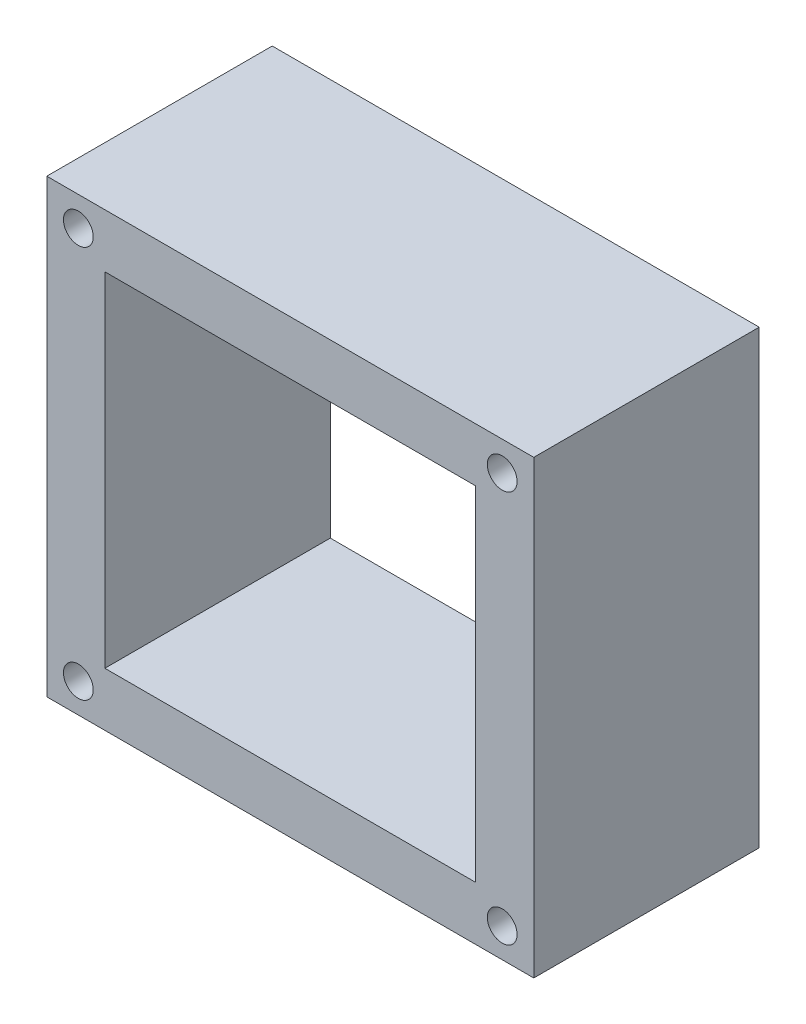
ISO-10303-21;
HEADER;
FILE_DESCRIPTION(('STEP AP214'),'2;1');
FILE_NAME('part.step','',(''),(''),'','','');
FILE_SCHEMA(('AUTOMOTIVE_DESIGN { 1 0 10303 214 1 1 1 1 }'));
ENDSEC;
DATA;
#1=APPLICATION_CONTEXT('core data for automotive mechanical design processes');
#2=APPLICATION_PROTOCOL_DEFINITION('international standard','automotive_design',2000,#1);
#3=PRODUCT_CONTEXT('',#1,'mechanical');
#4=PRODUCT('Part','Part','',(#3));
#5=PRODUCT_RELATED_PRODUCT_CATEGORY('part','',(#4));
#6=PRODUCT_DEFINITION_FORMATION('','',#4);
#7=PRODUCT_DEFINITION_CONTEXT('part definition',#1,'design');
#8=PRODUCT_DEFINITION('design','',#6,#7);
#9=PRODUCT_DEFINITION_SHAPE('','',#8);
#10=(LENGTH_UNIT() NAMED_UNIT(*) SI_UNIT(.MILLI.,.METRE.));
#11=(NAMED_UNIT(*) PLANE_ANGLE_UNIT() SI_UNIT($,.RADIAN.));
#12=(NAMED_UNIT(*) SI_UNIT($,.STERADIAN.) SOLID_ANGLE_UNIT());
#13=UNCERTAINTY_MEASURE_WITH_UNIT(LENGTH_MEASURE(1.E-05),#10,'distance_accuracy_value','');
#14=(GEOMETRIC_REPRESENTATION_CONTEXT(3) GLOBAL_UNCERTAINTY_ASSIGNED_CONTEXT((#13)) GLOBAL_UNIT_ASSIGNED_CONTEXT((#10,
#11,#12)) REPRESENTATION_CONTEXT('',''));
#15=CARTESIAN_POINT('',(0.,0.,0.));
#16=DIRECTION('',(0.,0.,1.));
#17=DIRECTION('',(1.,0.,0.));
#18=AXIS2_PLACEMENT_3D('',#15,#16,#17);
#19=CARTESIAN_POINT('',(0.,0.,50.));
#20=DIRECTION('',(0.,0.,-1.));
#21=DIRECTION('',(-1.,0.,0.));
#22=AXIS2_PLACEMENT_3D('',#19,#20,#21);
#23=PLANE('',#22);
#24=CARTESIAN_POINT('',(-47.,43.5,50.));
#25=DIRECTION('',(0.,0.,1.));
#26=DIRECTION('',(1.,0.,0.));
#27=AXIS2_PLACEMENT_3D('',#24,#25,#26);
#28=CIRCLE('',#27,3.29999999999999);
#29=CARTESIAN_POINT('',(-43.7,43.5,50.));
#30=VERTEX_POINT('',#29);
#31=EDGE_CURVE('E135',#30,#30,#28,.T.);
#32=ORIENTED_EDGE('',*,*,#31,.F.);
#33=EDGE_LOOP('',(#32));
#34=FACE_BOUND('',#33,.T.);
#35=CARTESIAN_POINT('',(-47.,-43.5,50.));
#36=DIRECTION('',(0.,0.,1.));
#37=DIRECTION('',(1.,0.,0.));
#38=AXIS2_PLACEMENT_3D('',#35,#36,#37);
#39=CIRCLE('',#38,3.3);
#40=CARTESIAN_POINT('',(-43.7,-43.5,50.));
#41=VERTEX_POINT('',#40);
#42=EDGE_CURVE('E141',#41,#41,#39,.T.);
#43=ORIENTED_EDGE('',*,*,#42,.F.);
#44=EDGE_LOOP('',(#43));
#45=FACE_BOUND('',#44,.T.);
#46=CARTESIAN_POINT('',(47.,-43.5,50.));
#47=DIRECTION('',(0.,0.,1.));
#48=DIRECTION('',(1.,0.,0.));
#49=AXIS2_PLACEMENT_3D('',#46,#47,#48);
#50=CIRCLE('',#49,3.3);
#51=CARTESIAN_POINT('',(50.3,-43.5,50.));
#52=VERTEX_POINT('',#51);
#53=EDGE_CURVE('E147',#52,#52,#50,.T.);
#54=ORIENTED_EDGE('',*,*,#53,.F.);
#55=EDGE_LOOP('',(#54));
#56=FACE_BOUND('',#55,.T.);
#57=CARTESIAN_POINT('',(47.,43.5,50.));
#58=DIRECTION('',(0.,0.,1.));
#59=DIRECTION('',(1.,0.,0.));
#60=AXIS2_PLACEMENT_3D('',#57,#58,#59);
#61=CIRCLE('',#60,3.29999999999999);
#62=CARTESIAN_POINT('',(50.3,43.5,50.));
#63=VERTEX_POINT('',#62);
#64=EDGE_CURVE('E153',#63,#63,#61,.T.);
#65=ORIENTED_EDGE('',*,*,#64,.F.);
#66=EDGE_LOOP('',(#65));
#67=FACE_BOUND('',#66,.T.);
#68=DIRECTION('',(0.,-1.,0.));
#69=VECTOR('',#68,1.);
#70=CARTESIAN_POINT('',(-54.,50.,50.));
#71=LINE('',#70,#69);
#72=CARTESIAN_POINT('',(-54.,50.,50.));
#73=VERTEX_POINT('',#72);
#74=CARTESIAN_POINT('',(-54.,-50.,50.));
#75=VERTEX_POINT('',#74);
#76=EDGE_CURVE('E159',#73,#75,#71,.T.);
#77=ORIENTED_EDGE('',*,*,#76,.T.);
#78=DIRECTION('',(1.,0.,0.));
#79=VECTOR('',#78,1.);
#80=CARTESIAN_POINT('',(54.,-50.,50.));
#81=LINE('',#80,#79);
#82=CARTESIAN_POINT('',(54.,-50.,50.));
#83=VERTEX_POINT('',#82);
#84=EDGE_CURVE('E162',#75,#83,#81,.T.);
#85=ORIENTED_EDGE('',*,*,#84,.T.);
#86=DIRECTION('',(0.,1.,0.));
#87=VECTOR('',#86,1.);
#88=CARTESIAN_POINT('',(54.,50.,50.));
#89=LINE('',#88,#87);
#90=CARTESIAN_POINT('',(54.,50.,50.));
#91=VERTEX_POINT('',#90);
#92=EDGE_CURVE('E165',#83,#91,#89,.T.);
#93=ORIENTED_EDGE('',*,*,#92,.T.);
#94=DIRECTION('',(-1.,0.,0.));
#95=VECTOR('',#94,1.);
#96=CARTESIAN_POINT('',(54.,50.,50.));
#97=LINE('',#96,#95);
#98=EDGE_CURVE('E167',#91,#73,#97,.T.);
#99=ORIENTED_EDGE('',*,*,#98,.T.);
#100=EDGE_LOOP('',(#77,#85,#93,#99));
#101=FACE_BOUND('',#100,.T.);
#102=DIRECTION('',(0.,1.,0.));
#103=VECTOR('',#102,1.);
#104=CARTESIAN_POINT('',(41.1206911699069,-38.0747140462101,50.));
#105=LINE('',#104,#103);
#106=CARTESIAN_POINT('',(41.1206911699069,-38.0747140462101,50.));
#107=VERTEX_POINT('',#106);
#108=CARTESIAN_POINT('',(41.1206911699069,38.0747140462101,50.));
#109=VERTEX_POINT('',#108);
#110=EDGE_CURVE('E99',#107,#109,#105,.T.);
#111=ORIENTED_EDGE('',*,*,#110,.F.);
#112=DIRECTION('',(1.,0.,0.));
#113=VECTOR('',#112,1.);
#114=CARTESIAN_POINT('',(-41.1206911699069,-38.0747140462101,50.));
#115=LINE('',#114,#113);
#116=CARTESIAN_POINT('',(-41.1206911699069,-38.0747140462101,50.));
#117=VERTEX_POINT('',#116);
#118=EDGE_CURVE('E121',#117,#107,#115,.T.);
#119=ORIENTED_EDGE('',*,*,#118,.F.);
#120=DIRECTION('',(0.,-1.,0.));
#121=VECTOR('',#120,1.);
#122=CARTESIAN_POINT('',(-41.1206911699069,-38.0747140462101,50.));
#123=LINE('',#122,#121);
#124=CARTESIAN_POINT('',(-41.1206911699069,38.0747140462101,50.));
#125=VERTEX_POINT('',#124);
#126=EDGE_CURVE('E119',#125,#117,#123,.T.);
#127=ORIENTED_EDGE('',*,*,#126,.F.);
#128=DIRECTION('',(-1.,0.,0.));
#129=VECTOR('',#128,1.);
#130=CARTESIAN_POINT('',(-41.1206911699069,38.0747140462101,50.));
#131=LINE('',#130,#129);
#132=EDGE_CURVE('E107',#109,#125,#131,.T.);
#133=ORIENTED_EDGE('',*,*,#132,.F.);
#134=EDGE_LOOP('',(#111,#119,#127,#133));
#135=FACE_BOUND('',#134,.T.);
#136=ADVANCED_FACE('F34',(#34,#45,#56,#67,#101,#135),#23,.F.);
#137=CARTESIAN_POINT('',(0.,0.,0.));
#138=DIRECTION('',(0.,0.,-1.));
#139=DIRECTION('',(-1.,0.,0.));
#140=AXIS2_PLACEMENT_3D('',#137,#138,#139);
#141=PLANE('',#140);
#142=CARTESIAN_POINT('',(-47.,-43.5,0.));
#143=DIRECTION('',(0.,0.,1.));
#144=DIRECTION('',(1.,0.,0.));
#145=AXIS2_PLACEMENT_3D('',#142,#143,#144);
#146=CIRCLE('',#145,3.3);
#147=CARTESIAN_POINT('',(-43.7,-43.5,0.));
#148=VERTEX_POINT('',#147);
#149=EDGE_CURVE('E138',#148,#148,#146,.T.);
#150=ORIENTED_EDGE('',*,*,#149,.T.);
#151=EDGE_LOOP('',(#150));
#152=FACE_BOUND('',#151,.T.);
#153=CARTESIAN_POINT('',(47.,43.5,0.));
#154=DIRECTION('',(0.,0.,1.));
#155=DIRECTION('',(1.,0.,0.));
#156=AXIS2_PLACEMENT_3D('',#153,#154,#155);
#157=CIRCLE('',#156,3.29999999999999);
#158=CARTESIAN_POINT('',(50.3,43.5,0.));
#159=VERTEX_POINT('',#158);
#160=EDGE_CURVE('E150',#159,#159,#157,.T.);
#161=ORIENTED_EDGE('',*,*,#160,.T.);
#162=EDGE_LOOP('',(#161));
#163=FACE_BOUND('',#162,.T.);
#164=DIRECTION('',(0.,-1.,0.));
#165=VECTOR('',#164,1.);
#166=CARTESIAN_POINT('',(-54.,50.,0.));
#167=LINE('',#166,#165);
#168=CARTESIAN_POINT('',(-54.,50.,0.));
#169=VERTEX_POINT('',#168);
#170=CARTESIAN_POINT('',(-54.,-50.,0.));
#171=VERTEX_POINT('',#170);
#172=EDGE_CURVE('E156',#169,#171,#167,.T.);
#173=ORIENTED_EDGE('',*,*,#172,.F.);
#174=DIRECTION('',(-1.,0.,0.));
#175=VECTOR('',#174,1.);
#176=CARTESIAN_POINT('',(54.,50.,0.));
#177=LINE('',#176,#175);
#178=CARTESIAN_POINT('',(54.,50.,0.));
#179=VERTEX_POINT('',#178);
#180=EDGE_CURVE('E163',#179,#169,#177,.T.);
#181=ORIENTED_EDGE('',*,*,#180,.F.);
#182=DIRECTION('',(0.,1.,0.));
#183=VECTOR('',#182,1.);
#184=CARTESIAN_POINT('',(54.,50.,0.));
#185=LINE('',#184,#183);
#186=CARTESIAN_POINT('',(54.,-50.,0.));
#187=VERTEX_POINT('',#186);
#188=EDGE_CURVE('E174',#187,#179,#185,.T.);
#189=ORIENTED_EDGE('',*,*,#188,.F.);
#190=DIRECTION('',(1.,0.,0.));
#191=VECTOR('',#190,1.);
#192=CARTESIAN_POINT('',(54.,-50.,0.));
#193=LINE('',#192,#191);
#194=EDGE_CURVE('E172',#171,#187,#193,.T.);
#195=ORIENTED_EDGE('',*,*,#194,.F.);
#196=EDGE_LOOP('',(#173,#181,#189,#195));
#197=FACE_BOUND('',#196,.T.);
#198=CARTESIAN_POINT('',(47.,-43.5,0.));
#199=DIRECTION('',(0.,0.,1.));
#200=DIRECTION('',(1.,0.,0.));
#201=AXIS2_PLACEMENT_3D('',#198,#199,#200);
#202=CIRCLE('',#201,3.3);
#203=CARTESIAN_POINT('',(50.3,-43.5,0.));
#204=VERTEX_POINT('',#203);
#205=EDGE_CURVE('E144',#204,#204,#202,.T.);
#206=ORIENTED_EDGE('',*,*,#205,.T.);
#207=EDGE_LOOP('',(#206));
#208=FACE_BOUND('',#207,.T.);
#209=CARTESIAN_POINT('',(-47.,43.5,0.));
#210=DIRECTION('',(0.,0.,1.));
#211=DIRECTION('',(1.,0.,0.));
#212=AXIS2_PLACEMENT_3D('',#209,#210,#211);
#213=CIRCLE('',#212,3.29999999999999);
#214=CARTESIAN_POINT('',(-43.7,43.5,0.));
#215=VERTEX_POINT('',#214);
#216=EDGE_CURVE('E115',#215,#215,#213,.T.);
#217=ORIENTED_EDGE('',*,*,#216,.T.);
#218=EDGE_LOOP('',(#217));
#219=FACE_BOUND('',#218,.T.);
#220=DIRECTION('',(1.,0.,0.));
#221=VECTOR('',#220,1.);
#222=CARTESIAN_POINT('',(-41.1206911699069,-38.0747140462101,0.));
#223=LINE('',#222,#221);
#224=CARTESIAN_POINT('',(-41.1206911699069,-38.0747140462101,0.));
#225=VERTEX_POINT('',#224);
#226=CARTESIAN_POINT('',(41.1206911699069,-38.0747140462101,0.));
#227=VERTEX_POINT('',#226);
#228=EDGE_CURVE('E108',#225,#227,#223,.T.);
#229=ORIENTED_EDGE('',*,*,#228,.T.);
#230=DIRECTION('',(0.,1.,0.));
#231=VECTOR('',#230,1.);
#232=CARTESIAN_POINT('',(41.1206911699069,-38.0747140462101,0.));
#233=LINE('',#232,#231);
#234=CARTESIAN_POINT('',(41.1206911699069,38.0747140462101,0.));
#235=VERTEX_POINT('',#234);
#236=EDGE_CURVE('E57',#227,#235,#233,.T.);
#237=ORIENTED_EDGE('',*,*,#236,.T.);
#238=DIRECTION('',(-1.,0.,0.));
#239=VECTOR('',#238,1.);
#240=CARTESIAN_POINT('',(-41.1206911699069,38.0747140462101,0.));
#241=LINE('',#240,#239);
#242=CARTESIAN_POINT('',(-41.1206911699069,38.0747140462101,0.));
#243=VERTEX_POINT('',#242);
#244=EDGE_CURVE('E114',#235,#243,#241,.T.);
#245=ORIENTED_EDGE('',*,*,#244,.T.);
#246=DIRECTION('',(0.,-1.,0.));
#247=VECTOR('',#246,1.);
#248=CARTESIAN_POINT('',(-41.1206911699069,-38.0747140462101,0.));
#249=LINE('',#248,#247);
#250=EDGE_CURVE('E127',#243,#225,#249,.T.);
#251=ORIENTED_EDGE('',*,*,#250,.T.);
#252=EDGE_LOOP('',(#229,#237,#245,#251));
#253=FACE_BOUND('',#252,.T.);
#254=ADVANCED_FACE('F192',(#152,#163,#197,#208,#219,#253),#141,.T.);
#255=CARTESIAN_POINT('',(-54.,50.,50.));
#256=DIRECTION('',(1.,0.,0.));
#257=DIRECTION('',(0.,0.,-1.));
#258=AXIS2_PLACEMENT_3D('',#255,#256,#257);
#259=PLANE('',#258);
#260=ORIENTED_EDGE('',*,*,#172,.T.);
#261=DIRECTION('',(0.,0.,-1.));
#262=VECTOR('',#261,1.);
#263=CARTESIAN_POINT('',(-54.,-50.,50.));
#264=LINE('',#263,#262);
#265=EDGE_CURVE('E11',#75,#171,#264,.T.);
#266=ORIENTED_EDGE('',*,*,#265,.F.);
#267=ORIENTED_EDGE('',*,*,#76,.F.);
#268=DIRECTION('',(0.,0.,-1.));
#269=VECTOR('',#268,1.);
#270=CARTESIAN_POINT('',(-54.,50.,50.));
#271=LINE('',#270,#269);
#272=EDGE_CURVE('E169',#73,#169,#271,.T.);
#273=ORIENTED_EDGE('',*,*,#272,.T.);
#274=EDGE_LOOP('',(#260,#266,#267,#273));
#275=FACE_BOUND('',#274,.T.);
#276=ADVANCED_FACE('F36',(#275),#259,.F.);
#277=CARTESIAN_POINT('',(54.,-50.,50.));
#278=DIRECTION('',(0.,1.,0.));
#279=DIRECTION('',(0.,0.,1.));
#280=AXIS2_PLACEMENT_3D('',#277,#278,#279);
#281=PLANE('',#280);
#282=ORIENTED_EDGE('',*,*,#194,.T.);
#283=DIRECTION('',(0.,0.,-1.));
#284=VECTOR('',#283,1.);
#285=CARTESIAN_POINT('',(54.,-50.,50.));
#286=LINE('',#285,#284);
#287=EDGE_CURVE('E42',#83,#187,#286,.T.);
#288=ORIENTED_EDGE('',*,*,#287,.F.);
#289=ORIENTED_EDGE('',*,*,#84,.F.);
#290=ORIENTED_EDGE('',*,*,#265,.T.);
#291=EDGE_LOOP('',(#282,#288,#289,#290));
#292=FACE_BOUND('',#291,.T.);
#293=ADVANCED_FACE('F202',(#292),#281,.F.);
#294=CARTESIAN_POINT('',(54.,50.,50.));
#295=DIRECTION('',(-1.,0.,0.));
#296=DIRECTION('',(0.,0.,1.));
#297=AXIS2_PLACEMENT_3D('',#294,#295,#296);
#298=PLANE('',#297);
#299=ORIENTED_EDGE('',*,*,#188,.T.);
#300=DIRECTION('',(0.,0.,-1.));
#301=VECTOR('',#300,1.);
#302=CARTESIAN_POINT('',(54.,50.,50.));
#303=LINE('',#302,#301);
#304=EDGE_CURVE('E179',#91,#179,#303,.T.);
#305=ORIENTED_EDGE('',*,*,#304,.F.);
#306=ORIENTED_EDGE('',*,*,#92,.F.);
#307=ORIENTED_EDGE('',*,*,#287,.T.);
#308=EDGE_LOOP('',(#299,#305,#306,#307));
#309=FACE_BOUND('',#308,.T.);
#310=ADVANCED_FACE('F186',(#309),#298,.F.);
#311=CARTESIAN_POINT('',(54.,50.,50.));
#312=DIRECTION('',(0.,-1.,0.));
#313=DIRECTION('',(0.,0.,-1.));
#314=AXIS2_PLACEMENT_3D('',#311,#312,#313);
#315=PLANE('',#314);
#316=ORIENTED_EDGE('',*,*,#180,.T.);
#317=ORIENTED_EDGE('',*,*,#272,.F.);
#318=ORIENTED_EDGE('',*,*,#98,.F.);
#319=ORIENTED_EDGE('',*,*,#304,.T.);
#320=EDGE_LOOP('',(#316,#317,#318,#319));
#321=FACE_BOUND('',#320,.T.);
#322=ADVANCED_FACE('F196',(#321),#315,.F.);
#323=CARTESIAN_POINT('',(47.,43.5,50.));
#324=DIRECTION('',(0.,0.,-1.));
#325=DIRECTION('',(-1.,0.,0.));
#326=AXIS2_PLACEMENT_3D('',#323,#324,#325);
#327=CYLINDRICAL_SURFACE('',#326,3.29999999999999);
#328=ORIENTED_EDGE('',*,*,#64,.T.);
#329=EDGE_LOOP('',(#328));
#330=FACE_BOUND('',#329,.T.);
#331=ORIENTED_EDGE('',*,*,#160,.F.);
#332=EDGE_LOOP('',(#331));
#333=FACE_BOUND('',#332,.T.);
#334=ADVANCED_FACE('F220',(#330,#333),#327,.F.);
#335=CARTESIAN_POINT('',(47.,-43.5,50.));
#336=DIRECTION('',(0.,0.,-1.));
#337=DIRECTION('',(-1.,0.,0.));
#338=AXIS2_PLACEMENT_3D('',#335,#336,#337);
#339=CYLINDRICAL_SURFACE('',#338,3.3);
#340=ORIENTED_EDGE('',*,*,#53,.T.);
#341=EDGE_LOOP('',(#340));
#342=FACE_BOUND('',#341,.T.);
#343=ORIENTED_EDGE('',*,*,#205,.F.);
#344=EDGE_LOOP('',(#343));
#345=FACE_BOUND('',#344,.T.);
#346=ADVANCED_FACE('F227',(#342,#345),#339,.F.);
#347=CARTESIAN_POINT('',(-47.,-43.5,50.));
#348=DIRECTION('',(0.,0.,-1.));
#349=DIRECTION('',(-1.,0.,0.));
#350=AXIS2_PLACEMENT_3D('',#347,#348,#349);
#351=CYLINDRICAL_SURFACE('',#350,3.3);
#352=ORIENTED_EDGE('',*,*,#42,.T.);
#353=EDGE_LOOP('',(#352));
#354=FACE_BOUND('',#353,.T.);
#355=ORIENTED_EDGE('',*,*,#149,.F.);
#356=EDGE_LOOP('',(#355));
#357=FACE_BOUND('',#356,.T.);
#358=ADVANCED_FACE('F232',(#354,#357),#351,.F.);
#359=CARTESIAN_POINT('',(-47.,43.5,50.));
#360=DIRECTION('',(0.,0.,-1.));
#361=DIRECTION('',(-1.,0.,0.));
#362=AXIS2_PLACEMENT_3D('',#359,#360,#361);
#363=CYLINDRICAL_SURFACE('',#362,3.29999999999999);
#364=ORIENTED_EDGE('',*,*,#31,.T.);
#365=EDGE_LOOP('',(#364));
#366=FACE_BOUND('',#365,.T.);
#367=ORIENTED_EDGE('',*,*,#216,.F.);
#368=EDGE_LOOP('',(#367));
#369=FACE_BOUND('',#368,.T.);
#370=ADVANCED_FACE('F242',(#366,#369),#363,.F.);
#371=CARTESIAN_POINT('',(41.1206911699069,-38.0747140462101,50.));
#372=DIRECTION('',(-1.,0.,0.));
#373=DIRECTION('',(0.,0.,1.));
#374=AXIS2_PLACEMENT_3D('',#371,#372,#373);
#375=PLANE('',#374);
#376=ORIENTED_EDGE('',*,*,#236,.F.);
#377=DIRECTION('',(0.,0.,-1.));
#378=VECTOR('',#377,1.);
#379=CARTESIAN_POINT('',(41.1206911699069,-38.0747140462101,50.));
#380=LINE('',#379,#378);
#381=EDGE_CURVE('E103',#107,#227,#380,.T.);
#382=ORIENTED_EDGE('',*,*,#381,.F.);
#383=ORIENTED_EDGE('',*,*,#110,.T.);
#384=DIRECTION('',(0.,0.,-1.));
#385=VECTOR('',#384,1.);
#386=CARTESIAN_POINT('',(41.1206911699069,38.0747140462101,50.));
#387=LINE('',#386,#385);
#388=EDGE_CURVE('E102',#109,#235,#387,.T.);
#389=ORIENTED_EDGE('',*,*,#388,.T.);
#390=EDGE_LOOP('',(#376,#382,#383,#389));
#391=FACE_BOUND('',#390,.T.);
#392=ADVANCED_FACE('F101',(#391),#375,.T.);
#393=CARTESIAN_POINT('',(-41.1206911699069,38.0747140462101,50.));
#394=DIRECTION('',(0.,-1.,0.));
#395=DIRECTION('',(0.,0.,-1.));
#396=AXIS2_PLACEMENT_3D('',#393,#394,#395);
#397=PLANE('',#396);
#398=ORIENTED_EDGE('',*,*,#244,.F.);
#399=ORIENTED_EDGE('',*,*,#388,.F.);
#400=ORIENTED_EDGE('',*,*,#132,.T.);
#401=DIRECTION('',(0.,0.,-1.));
#402=VECTOR('',#401,1.);
#403=CARTESIAN_POINT('',(-41.1206911699069,38.0747140462101,50.));
#404=LINE('',#403,#402);
#405=EDGE_CURVE('E116',#125,#243,#404,.T.);
#406=ORIENTED_EDGE('',*,*,#405,.T.);
#407=EDGE_LOOP('',(#398,#399,#400,#406));
#408=FACE_BOUND('',#407,.T.);
#409=ADVANCED_FACE('F111',(#408),#397,.T.);
#410=CARTESIAN_POINT('',(-41.1206911699069,-38.0747140462101,50.));
#411=DIRECTION('',(1.,0.,0.));
#412=DIRECTION('',(0.,0.,-1.));
#413=AXIS2_PLACEMENT_3D('',#410,#411,#412);
#414=PLANE('',#413);
#415=ORIENTED_EDGE('',*,*,#250,.F.);
#416=ORIENTED_EDGE('',*,*,#405,.F.);
#417=ORIENTED_EDGE('',*,*,#126,.T.);
#418=DIRECTION('',(0.,0.,-1.));
#419=VECTOR('',#418,1.);
#420=CARTESIAN_POINT('',(-41.1206911699069,-38.0747140462101,50.));
#421=LINE('',#420,#419);
#422=EDGE_CURVE('E49',#117,#225,#421,.T.);
#423=ORIENTED_EDGE('',*,*,#422,.T.);
#424=EDGE_LOOP('',(#415,#416,#417,#423));
#425=FACE_BOUND('',#424,.T.);
#426=ADVANCED_FACE('F254',(#425),#414,.T.);
#427=CARTESIAN_POINT('',(-41.1206911699069,-38.0747140462101,50.));
#428=DIRECTION('',(0.,1.,0.));
#429=DIRECTION('',(0.,0.,1.));
#430=AXIS2_PLACEMENT_3D('',#427,#428,#429);
#431=PLANE('',#430);
#432=ORIENTED_EDGE('',*,*,#228,.F.);
#433=ORIENTED_EDGE('',*,*,#422,.F.);
#434=ORIENTED_EDGE('',*,*,#118,.T.);
#435=ORIENTED_EDGE('',*,*,#381,.T.);
#436=EDGE_LOOP('',(#432,#433,#434,#435));
#437=FACE_BOUND('',#436,.T.);
#438=ADVANCED_FACE('F257',(#437),#431,.T.);
#439=CLOSED_SHELL('',(#136,#254,#276,#293,#310,#322,#334,#346,#358,#370,#392,#409,#426,#438));
#440=MANIFOLD_SOLID_BREP('B2',#439);
#441=ADVANCED_BREP_SHAPE_REPRESENTATION('',(#18,#440),#14);
#442=SHAPE_DEFINITION_REPRESENTATION(#9,#441);
ENDSEC;
END-ISO-10303-21;
